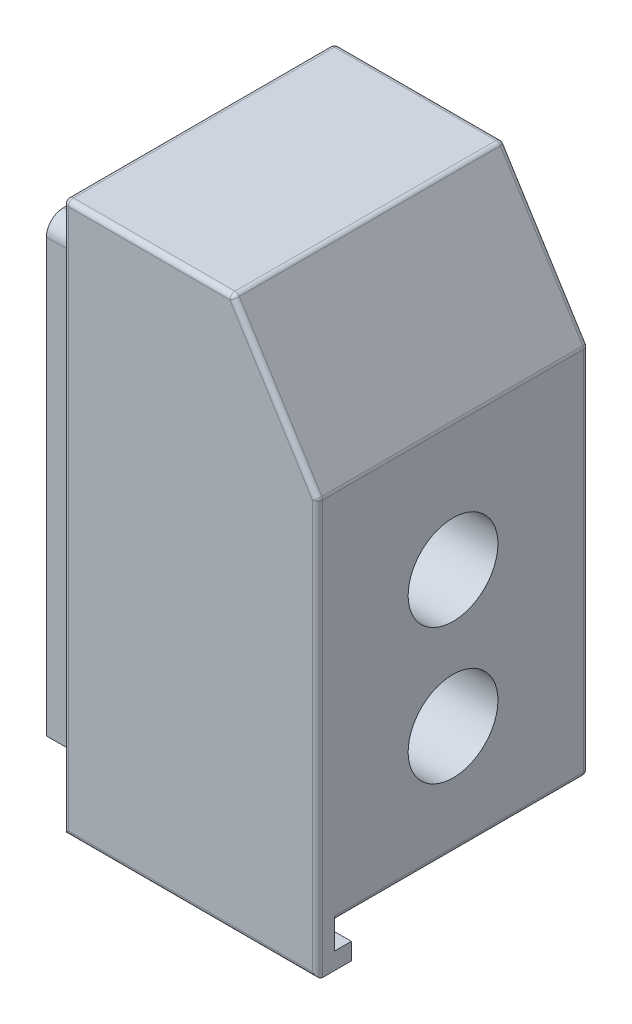
ISO-10303-21;
HEADER;
FILE_DESCRIPTION(('STEP AP214'),'2;1');
FILE_NAME('part.step','',(''),(''),'','','');
FILE_SCHEMA(('AUTOMOTIVE_DESIGN { 1 0 10303 214 1 1 1 1 }'));
ENDSEC;
DATA;
#1=APPLICATION_CONTEXT('core data for automotive mechanical design processes');
#2=APPLICATION_PROTOCOL_DEFINITION('international standard','automotive_design',2000,#1);
#3=PRODUCT_CONTEXT('',#1,'mechanical');
#4=PRODUCT('Part','Part','',(#3));
#5=PRODUCT_RELATED_PRODUCT_CATEGORY('part','',(#4));
#6=PRODUCT_DEFINITION_FORMATION('','',#4);
#7=PRODUCT_DEFINITION_CONTEXT('part definition',#1,'design');
#8=PRODUCT_DEFINITION('design','',#6,#7);
#9=PRODUCT_DEFINITION_SHAPE('','',#8);
#10=(LENGTH_UNIT() NAMED_UNIT(*) SI_UNIT(.MILLI.,.METRE.));
#11=(NAMED_UNIT(*) PLANE_ANGLE_UNIT() SI_UNIT($,.RADIAN.));
#12=(NAMED_UNIT(*) SI_UNIT($,.STERADIAN.) SOLID_ANGLE_UNIT());
#13=UNCERTAINTY_MEASURE_WITH_UNIT(LENGTH_MEASURE(1.E-05),#10,'distance_accuracy_value','');
#14=(GEOMETRIC_REPRESENTATION_CONTEXT(3) GLOBAL_UNCERTAINTY_ASSIGNED_CONTEXT((#13)) GLOBAL_UNIT_ASSIGNED_CONTEXT((#10,
#11,#12)) REPRESENTATION_CONTEXT('',''));
#15=CARTESIAN_POINT('',(0.,0.,0.));
#16=DIRECTION('',(0.,0.,1.));
#17=DIRECTION('',(1.,0.,0.));
#18=AXIS2_PLACEMENT_3D('',#15,#16,#17);
#19=CARTESIAN_POINT('',(-2.,27.5,1.));
#20=DIRECTION('',(0.,0.,1.));
#21=DIRECTION('',(0.,-1.,0.));
#22=AXIS2_PLACEMENT_3D('',#19,#20,#21);
#23=PLANE('',#22);
#24=DIRECTION('',(0.,-1.,0.));
#25=VECTOR('',#24,1.);
#26=CARTESIAN_POINT('',(-2.,27.5,1.));
#27=LINE('',#26,#25);
#28=CARTESIAN_POINT('',(-2.,26.5,1.));
#29=VERTEX_POINT('',#28);
#30=CARTESIAN_POINT('',(-2.,0.999999999999998,1.));
#31=VERTEX_POINT('',#30);
#32=EDGE_CURVE('E95',#29,#31,#27,.T.);
#33=ORIENTED_EDGE('',*,*,#32,.F.);
#34=DIRECTION('',(1.,0.,0.));
#35=VECTOR('',#34,1.);
#36=CARTESIAN_POINT('',(-2.,26.5,1.));
#37=LINE('',#36,#35);
#38=CARTESIAN_POINT('',(0.,26.5,1.));
#39=VERTEX_POINT('',#38);
#40=EDGE_CURVE('E12',#29,#39,#37,.T.);
#41=ORIENTED_EDGE('',*,*,#40,.T.);
#42=DIRECTION('',(0.,-1.,0.));
#43=VECTOR('',#42,1.);
#44=CARTESIAN_POINT('',(0.,27.5,1.));
#45=LINE('',#44,#43);
#46=CARTESIAN_POINT('',(0.,0.999999999999998,1.));
#47=VERTEX_POINT('',#46);
#48=EDGE_CURVE('E114',#39,#47,#45,.T.);
#49=ORIENTED_EDGE('',*,*,#48,.T.);
#50=DIRECTION('',(1.,0.,0.));
#51=VECTOR('',#50,1.);
#52=CARTESIAN_POINT('',(-2.,0.999999999999998,1.));
#53=LINE('',#52,#51);
#54=EDGE_CURVE('E108',#31,#47,#53,.T.);
#55=ORIENTED_EDGE('',*,*,#54,.F.);
#56=EDGE_LOOP('',(#33,#41,#49,#55));
#57=FACE_BOUND('',#56,.T.);
#58=ADVANCED_FACE('F42',(#57),#23,.F.);
#59=CARTESIAN_POINT('',(-2.,1.,15.));
#60=DIRECTION('',(0.,1.,0.));
#61=DIRECTION('',(0.,0.,1.));
#62=AXIS2_PLACEMENT_3D('',#59,#60,#61);
#63=PLANE('',#62);
#64=DIRECTION('',(0.,0.,1.));
#65=VECTOR('',#64,1.);
#66=CARTESIAN_POINT('',(0.,1.,15.));
#67=LINE('',#66,#65);
#68=CARTESIAN_POINT('',(0.,1.,15.));
#69=VERTEX_POINT('',#68);
#70=EDGE_CURVE('E147',#47,#69,#67,.T.);
#71=ORIENTED_EDGE('',*,*,#70,.T.);
#72=DIRECTION('',(1.,0.,0.));
#73=VECTOR('',#72,1.);
#74=CARTESIAN_POINT('',(-2.,1.,15.));
#75=LINE('',#74,#73);
#76=CARTESIAN_POINT('',(-2.,1.,15.));
#77=VERTEX_POINT('',#76);
#78=EDGE_CURVE('E110',#77,#69,#75,.T.);
#79=ORIENTED_EDGE('',*,*,#78,.F.);
#80=DIRECTION('',(0.,0.,1.));
#81=VECTOR('',#80,1.);
#82=CARTESIAN_POINT('',(-2.,1.,15.));
#83=LINE('',#82,#81);
#84=EDGE_CURVE('E98',#31,#77,#83,.T.);
#85=ORIENTED_EDGE('',*,*,#84,.F.);
#86=ORIENTED_EDGE('',*,*,#54,.T.);
#87=EDGE_LOOP('',(#71,#79,#85,#86));
#88=FACE_BOUND('',#87,.T.);
#89=ADVANCED_FACE('F107',(#88),#63,.F.);
#90=CARTESIAN_POINT('',(-2.,27.5,15.));
#91=DIRECTION('',(0.,0.,-1.));
#92=DIRECTION('',(0.,1.,0.));
#93=AXIS2_PLACEMENT_3D('',#90,#91,#92);
#94=PLANE('',#93);
#95=DIRECTION('',(0.,1.,0.));
#96=VECTOR('',#95,1.);
#97=CARTESIAN_POINT('',(0.,27.5,15.));
#98=LINE('',#97,#96);
#99=CARTESIAN_POINT('',(0.,26.5,15.));
#100=VERTEX_POINT('',#99);
#101=EDGE_CURVE('E145',#69,#100,#98,.T.);
#102=ORIENTED_EDGE('',*,*,#101,.T.);
#103=DIRECTION('',(1.,0.,0.));
#104=VECTOR('',#103,1.);
#105=CARTESIAN_POINT('',(-2.,26.5,15.));
#106=LINE('',#105,#104);
#107=CARTESIAN_POINT('',(-2.,26.5,15.));
#108=VERTEX_POINT('',#107);
#109=EDGE_CURVE('E65',#100,#108,#106,.F.);
#110=ORIENTED_EDGE('',*,*,#109,.T.);
#111=DIRECTION('',(0.,1.,0.));
#112=VECTOR('',#111,1.);
#113=CARTESIAN_POINT('',(-2.,27.5,15.));
#114=LINE('',#113,#112);
#115=EDGE_CURVE('E111',#77,#108,#114,.T.);
#116=ORIENTED_EDGE('',*,*,#115,.F.);
#117=ORIENTED_EDGE('',*,*,#78,.T.);
#118=EDGE_LOOP('',(#102,#110,#116,#117));
#119=FACE_BOUND('',#118,.T.);
#120=ADVANCED_FACE('F146',(#119),#94,.F.);
#121=CARTESIAN_POINT('',(-2.,27.5,15.));
#122=DIRECTION('',(0.,-1.,0.));
#123=DIRECTION('',(0.,0.,-1.));
#124=AXIS2_PLACEMENT_3D('',#121,#122,#123);
#125=PLANE('',#124);
#126=DIRECTION('',(0.,0.,-1.));
#127=VECTOR('',#126,1.);
#128=CARTESIAN_POINT('',(-2.,27.5,15.));
#129=LINE('',#128,#127);
#130=CARTESIAN_POINT('',(-2.,27.5,14.));
#131=VERTEX_POINT('',#130);
#132=CARTESIAN_POINT('',(-2.,27.5,2.00000000000001));
#133=VERTEX_POINT('',#132);
#134=EDGE_CURVE('E120',#131,#133,#129,.T.);
#135=ORIENTED_EDGE('',*,*,#134,.F.);
#136=DIRECTION('',(1.,0.,0.));
#137=VECTOR('',#136,1.);
#138=CARTESIAN_POINT('',(-2.,27.5,14.));
#139=LINE('',#138,#137);
#140=CARTESIAN_POINT('',(0.,27.5,14.));
#141=VERTEX_POINT('',#140);
#142=EDGE_CURVE('E118',#131,#141,#139,.T.);
#143=ORIENTED_EDGE('',*,*,#142,.T.);
#144=DIRECTION('',(0.,0.,-1.));
#145=VECTOR('',#144,1.);
#146=CARTESIAN_POINT('',(0.,27.5,15.));
#147=LINE('',#146,#145);
#148=CARTESIAN_POINT('',(0.,27.5,2.00000000000001));
#149=VERTEX_POINT('',#148);
#150=EDGE_CURVE('E103',#141,#149,#147,.T.);
#151=ORIENTED_EDGE('',*,*,#150,.T.);
#152=DIRECTION('',(1.,0.,0.));
#153=VECTOR('',#152,1.);
#154=CARTESIAN_POINT('',(-2.,27.5,2.));
#155=LINE('',#154,#153);
#156=EDGE_CURVE('E116',#149,#133,#155,.F.);
#157=ORIENTED_EDGE('',*,*,#156,.T.);
#158=EDGE_LOOP('',(#135,#143,#151,#157));
#159=FACE_BOUND('',#158,.T.);
#160=ADVANCED_FACE('F136',(#159),#125,.F.);
#161=CARTESIAN_POINT('',(-2.,0.,0.));
#162=DIRECTION('',(1.,0.,0.));
#163=DIRECTION('',(0.,0.,-1.));
#164=AXIS2_PLACEMENT_3D('',#161,#162,#163);
#165=PLANE('',#164);
#166=ORIENTED_EDGE('',*,*,#115,.T.);
#167=CARTESIAN_POINT('',(-2.,26.5,14.));
#168=DIRECTION('',(1.,0.,0.));
#169=DIRECTION('',(0.,0.,-1.));
#170=AXIS2_PLACEMENT_3D('',#167,#168,#169);
#171=CIRCLE('',#170,1.);
#172=EDGE_CURVE('E50',#108,#131,#171,.F.);
#173=ORIENTED_EDGE('',*,*,#172,.T.);
#174=ORIENTED_EDGE('',*,*,#134,.T.);
#175=CARTESIAN_POINT('',(-2.,26.5,2.));
#176=DIRECTION('',(1.,0.,0.));
#177=DIRECTION('',(0.,0.,-1.));
#178=AXIS2_PLACEMENT_3D('',#175,#176,#177);
#179=CIRCLE('',#178,1.);
#180=EDGE_CURVE('E57',#133,#29,#179,.F.);
#181=ORIENTED_EDGE('',*,*,#180,.T.);
#182=ORIENTED_EDGE('',*,*,#32,.T.);
#183=ORIENTED_EDGE('',*,*,#84,.T.);
#184=EDGE_LOOP('',(#166,#173,#174,#181,#182,#183));
#185=FACE_BOUND('',#184,.T.);
#186=ADVANCED_FACE('F97',(#185),#165,.F.);
#187=CARTESIAN_POINT('',(0.,0.,0.));
#188=DIRECTION('',(1.,0.,0.));
#189=DIRECTION('',(0.,0.,-1.));
#190=AXIS2_PLACEMENT_3D('',#187,#188,#189);
#191=PLANE('',#190);
#192=ORIENTED_EDGE('',*,*,#150,.F.);
#193=CARTESIAN_POINT('',(0.,26.5,14.));
#194=DIRECTION('',(1.,0.,0.));
#195=DIRECTION('',(0.,0.,-1.));
#196=AXIS2_PLACEMENT_3D('',#193,#194,#195);
#197=CIRCLE('',#196,1.);
#198=EDGE_CURVE('E128',#141,#100,#197,.T.);
#199=ORIENTED_EDGE('',*,*,#198,.T.);
#200=ORIENTED_EDGE('',*,*,#101,.F.);
#201=ORIENTED_EDGE('',*,*,#70,.F.);
#202=ORIENTED_EDGE('',*,*,#48,.F.);
#203=CARTESIAN_POINT('',(0.,26.5,2.));
#204=DIRECTION('',(1.,0.,0.));
#205=DIRECTION('',(0.,0.,-1.));
#206=AXIS2_PLACEMENT_3D('',#203,#204,#205);
#207=CIRCLE('',#206,1.);
#208=EDGE_CURVE('E126',#39,#149,#207,.T.);
#209=ORIENTED_EDGE('',*,*,#208,.T.);
#210=EDGE_LOOP('',(#192,#199,#200,#201,#202,#209));
#211=FACE_BOUND('',#210,.T.);
#212=ADVANCED_FACE('F144',(#211),#191,.T.);
#213=CARTESIAN_POINT('',(-2.,26.5,14.));
#214=DIRECTION('',(1.,0.,0.));
#215=DIRECTION('',(0.,0.,-1.));
#216=AXIS2_PLACEMENT_3D('',#213,#214,#215);
#217=CYLINDRICAL_SURFACE('',#216,1.);
#218=ORIENTED_EDGE('',*,*,#172,.F.);
#219=ORIENTED_EDGE('',*,*,#109,.F.);
#220=ORIENTED_EDGE('',*,*,#198,.F.);
#221=ORIENTED_EDGE('',*,*,#142,.F.);
#222=EDGE_LOOP('',(#218,#219,#220,#221));
#223=FACE_BOUND('',#222,.T.);
#224=ADVANCED_FACE('F141',(#223),#217,.T.);
#225=CARTESIAN_POINT('',(-2.,26.5,2.));
#226=DIRECTION('',(1.,0.,0.));
#227=DIRECTION('',(0.,0.,-1.));
#228=AXIS2_PLACEMENT_3D('',#225,#226,#227);
#229=CYLINDRICAL_SURFACE('',#228,1.);
#230=ORIENTED_EDGE('',*,*,#180,.F.);
#231=ORIENTED_EDGE('',*,*,#156,.F.);
#232=ORIENTED_EDGE('',*,*,#208,.F.);
#233=ORIENTED_EDGE('',*,*,#40,.F.);
#234=EDGE_LOOP('',(#230,#231,#232,#233));
#235=FACE_BOUND('',#234,.T.);
#236=ADVANCED_FACE('F44',(#235),#229,.T.);
#237=CLOSED_SHELL('',(#58,#89,#120,#160,#186,#212,#224,#236));
#238=MANIFOLD_SOLID_BREP('B2',#237);
#239=CARTESIAN_POINT('',(15.,0.,16.));
#240=DIRECTION('',(0.,1.,0.));
#241=DIRECTION('',(-1.,0.,0.));
#242=AXIS2_PLACEMENT_3D('',#239,#240,#241);
#243=PLANE('',#242);
#244=DIRECTION('',(0.,0.,-1.));
#245=VECTOR('',#244,1.);
#246=CARTESIAN_POINT('',(0.,0.,16.));
#247=LINE('',#246,#245);
#248=CARTESIAN_POINT('',(0.,0.,15.));
#249=VERTEX_POINT('',#248);
#250=CARTESIAN_POINT('',(0.,0.,0.300000000000002));
#251=VERTEX_POINT('',#250);
#252=EDGE_CURVE('E384',#249,#251,#247,.T.);
#253=ORIENTED_EDGE('',*,*,#252,.T.);
#254=DIRECTION('',(1.,0.,0.));
#255=VECTOR('',#254,1.);
#256=CARTESIAN_POINT('',(15.,0.,0.300000000000002));
#257=LINE('',#256,#255);
#258=CARTESIAN_POINT('',(14.7,0.,0.300000000000002));
#259=VERTEX_POINT('',#258);
#260=EDGE_CURVE('E428',#251,#259,#257,.T.);
#261=ORIENTED_EDGE('',*,*,#260,.T.);
#262=DIRECTION('',(0.,0.,-1.));
#263=VECTOR('',#262,1.);
#264=CARTESIAN_POINT('',(14.7,0.,16.));
#265=LINE('',#264,#263);
#266=CARTESIAN_POINT('',(14.7,0.,15.));
#267=VERTEX_POINT('',#266);
#268=EDGE_CURVE('E426',#259,#267,#265,.F.);
#269=ORIENTED_EDGE('',*,*,#268,.T.);
#270=DIRECTION('',(1.,0.,0.));
#271=VECTOR('',#270,1.);
#272=CARTESIAN_POINT('',(-3.20156211871642,0.,15.));
#273=LINE('',#272,#271);
#274=EDGE_CURVE('E380',#249,#267,#273,.T.);
#275=ORIENTED_EDGE('',*,*,#274,.F.);
#276=EDGE_LOOP('',(#253,#261,#269,#275));
#277=FACE_BOUND('',#276,.T.);
#278=ADVANCED_FACE('F217',(#277),#243,.F.);
#279=CARTESIAN_POINT('',(15.,22.,16.));
#280=DIRECTION('',(-1.,0.,0.));
#281=DIRECTION('',(0.,-1.,0.));
#282=AXIS2_PLACEMENT_3D('',#279,#280,#281);
#283=PLANE('',#282);
#284=CARTESIAN_POINT('',(15.,14.5,8.));
#285=DIRECTION('',(1.,0.,0.));
#286=DIRECTION('',(0.,1.,0.));
#287=AXIS2_PLACEMENT_3D('',#284,#285,#286);
#288=CIRCLE('',#287,2.65);
#289=CARTESIAN_POINT('',(15.,17.15,8.));
#290=VERTEX_POINT('',#289);
#291=EDGE_CURVE('E400',#290,#290,#288,.T.);
#292=ORIENTED_EDGE('',*,*,#291,.F.);
#293=EDGE_LOOP('',(#292));
#294=FACE_BOUND('',#293,.T.);
#295=CARTESIAN_POINT('',(15.,6.5,8.));
#296=DIRECTION('',(1.,0.,0.));
#297=DIRECTION('',(0.,1.,0.));
#298=AXIS2_PLACEMENT_3D('',#295,#296,#297);
#299=CIRCLE('',#298,2.65);
#300=CARTESIAN_POINT('',(15.,9.15,8.));
#301=VERTEX_POINT('',#300);
#302=EDGE_CURVE('E396',#301,#301,#299,.T.);
#303=ORIENTED_EDGE('',*,*,#302,.F.);
#304=EDGE_LOOP('',(#303));
#305=FACE_BOUND('',#304,.T.);
#306=DIRECTION('',(0.,0.,-1.));
#307=VECTOR('',#306,1.);
#308=CARTESIAN_POINT('',(15.,21.9139611320766,16.));
#309=LINE('',#308,#307);
#310=CARTESIAN_POINT('',(15.,21.9139611320766,0.300000000000002));
#311=VERTEX_POINT('',#310);
#312=CARTESIAN_POINT('',(15.,21.9139611320766,15.7));
#313=VERTEX_POINT('',#312);
#314=EDGE_CURVE('E406',#311,#313,#309,.F.);
#315=ORIENTED_EDGE('',*,*,#314,.T.);
#316=DIRECTION('',(0.,1.,0.));
#317=VECTOR('',#316,1.);
#318=CARTESIAN_POINT('',(15.,22.,15.7));
#319=LINE('',#318,#317);
#320=CARTESIAN_POINT('',(15.,-2.5,15.7));
#321=VERTEX_POINT('',#320);
#322=EDGE_CURVE('E351',#313,#321,#319,.F.);
#323=ORIENTED_EDGE('',*,*,#322,.T.);
#324=DIRECTION('',(0.,0.,-1.));
#325=VECTOR('',#324,1.);
#326=CARTESIAN_POINT('',(15.,-2.5,16.));
#327=LINE('',#326,#325);
#328=CARTESIAN_POINT('',(15.,-2.5,14.));
#329=VERTEX_POINT('',#328);
#330=EDGE_CURVE('E344',#321,#329,#327,.T.);
#331=ORIENTED_EDGE('',*,*,#330,.T.);
#332=DIRECTION('',(0.,1.,0.));
#333=VECTOR('',#332,1.);
#334=CARTESIAN_POINT('',(15.,-1.5,14.));
#335=LINE('',#334,#333);
#336=CARTESIAN_POINT('',(15.,-1.5,14.));
#337=VERTEX_POINT('',#336);
#338=EDGE_CURVE('E349',#329,#337,#335,.T.);
#339=ORIENTED_EDGE('',*,*,#338,.T.);
#340=DIRECTION('',(0.,0.,1.));
#341=VECTOR('',#340,1.);
#342=CARTESIAN_POINT('',(15.,-1.5,15.));
#343=LINE('',#342,#341);
#344=CARTESIAN_POINT('',(15.,-1.5,15.));
#345=VERTEX_POINT('',#344);
#346=EDGE_CURVE('E370',#337,#345,#343,.T.);
#347=ORIENTED_EDGE('',*,*,#346,.T.);
#348=DIRECTION('',(0.,1.,0.));
#349=VECTOR('',#348,1.);
#350=CARTESIAN_POINT('',(15.,0.,15.));
#351=LINE('',#350,#349);
#352=CARTESIAN_POINT('',(15.,0.299999999999998,15.));
#353=VERTEX_POINT('',#352);
#354=EDGE_CURVE('E365',#345,#353,#351,.T.);
#355=ORIENTED_EDGE('',*,*,#354,.T.);
#356=DIRECTION('',(0.,0.,-1.));
#357=VECTOR('',#356,1.);
#358=CARTESIAN_POINT('',(15.,0.299999999999998,16.));
#359=LINE('',#358,#357);
#360=CARTESIAN_POINT('',(15.,0.299999999999998,0.300000000000002));
#361=VERTEX_POINT('',#360);
#362=EDGE_CURVE('E401',#353,#361,#359,.T.);
#363=ORIENTED_EDGE('',*,*,#362,.T.);
#364=DIRECTION('',(0.,1.,0.));
#365=VECTOR('',#364,1.);
#366=CARTESIAN_POINT('',(15.,22.,0.300000000000002));
#367=LINE('',#366,#365);
#368=EDGE_CURVE('E403',#361,#311,#367,.T.);
#369=ORIENTED_EDGE('',*,*,#368,.T.);
#370=EDGE_LOOP('',(#315,#323,#331,#339,#347,#355,#363,#369));
#371=FACE_BOUND('',#370,.T.);
#372=ADVANCED_FACE('F346',(#294,#305,#371),#283,.F.);
#373=CARTESIAN_POINT('',(10.,30.,16.));
#374=DIRECTION('',(-0.847998304005088,-0.52999894000318,0.));
#375=DIRECTION('',(0.52999894000318,-0.847998304005088,0.));
#376=AXIS2_PLACEMENT_3D('',#373,#374,#375);
#377=PLANE('',#376);
#378=DIRECTION('',(-0.52999894000318,0.847998304005088,0.));
#379=VECTOR('',#378,1.);
#380=CARTESIAN_POINT('',(10.,30.,15.7));
#381=LINE('',#380,#379);
#382=CARTESIAN_POINT('',(10.0881251987494,29.8589996820009,15.7));
#383=VERTEX_POINT('',#382);
#384=CARTESIAN_POINT('',(14.9543994912015,22.0729608140776,15.7));
#385=VERTEX_POINT('',#384);
#386=EDGE_CURVE('E447',#383,#385,#381,.F.);
#387=ORIENTED_EDGE('',*,*,#386,.T.);
#388=DIRECTION('',(0.,0.,-1.));
#389=VECTOR('',#388,1.);
#390=CARTESIAN_POINT('',(14.9543994912015,22.0729608140776,16.));
#391=LINE('',#390,#389);
#392=CARTESIAN_POINT('',(14.9543994912015,22.0729608140776,0.300000000000002));
#393=VERTEX_POINT('',#392);
#394=EDGE_CURVE('E449',#385,#393,#391,.T.);
#395=ORIENTED_EDGE('',*,*,#394,.T.);
#396=DIRECTION('',(-0.52999894000318,0.847998304005088,0.));
#397=VECTOR('',#396,1.);
#398=CARTESIAN_POINT('',(10.,30.,0.300000000000002));
#399=LINE('',#398,#397);
#400=CARTESIAN_POINT('',(10.0881251987494,29.8589996820009,0.300000000000002));
#401=VERTEX_POINT('',#400);
#402=EDGE_CURVE('E445',#393,#401,#399,.T.);
#403=ORIENTED_EDGE('',*,*,#402,.T.);
#404=DIRECTION('',(0.,0.,-1.));
#405=VECTOR('',#404,1.);
#406=CARTESIAN_POINT('',(10.0881251987494,29.8589996820009,16.));
#407=LINE('',#406,#405);
#408=EDGE_CURVE('E443',#401,#383,#407,.F.);
#409=ORIENTED_EDGE('',*,*,#408,.T.);
#410=EDGE_LOOP('',(#387,#395,#403,#409));
#411=FACE_BOUND('',#410,.T.);
#412=ADVANCED_FACE('F606',(#411),#377,.F.);
#413=CARTESIAN_POINT('',(0.,30.,16.));
#414=DIRECTION('',(0.,-1.,0.));
#415=DIRECTION('',(0.,0.,-1.));
#416=AXIS2_PLACEMENT_3D('',#413,#414,#415);
#417=PLANE('',#416);
#418=DIRECTION('',(-1.,0.,0.));
#419=VECTOR('',#418,1.);
#420=CARTESIAN_POINT('',(0.,30.,15.7));
#421=LINE('',#420,#419);
#422=CARTESIAN_POINT('',(0.3,30.,15.7));
#423=VERTEX_POINT('',#422);
#424=CARTESIAN_POINT('',(9.83372570754788,30.,15.7));
#425=VERTEX_POINT('',#424);
#426=EDGE_CURVE('E234',#423,#425,#421,.F.);
#427=ORIENTED_EDGE('',*,*,#426,.T.);
#428=DIRECTION('',(0.,0.,-1.));
#429=VECTOR('',#428,1.);
#430=CARTESIAN_POINT('',(9.83372570754788,30.,16.));
#431=LINE('',#430,#429);
#432=CARTESIAN_POINT('',(9.83372570754788,30.,0.300000000000002));
#433=VERTEX_POINT('',#432);
#434=EDGE_CURVE('E226',#425,#433,#431,.T.);
#435=ORIENTED_EDGE('',*,*,#434,.T.);
#436=DIRECTION('',(-1.,0.,0.));
#437=VECTOR('',#436,1.);
#438=CARTESIAN_POINT('',(0.,30.,0.300000000000002));
#439=LINE('',#438,#437);
#440=CARTESIAN_POINT('',(0.3,30.,0.300000000000002));
#441=VERTEX_POINT('',#440);
#442=EDGE_CURVE('E452',#433,#441,#439,.T.);
#443=ORIENTED_EDGE('',*,*,#442,.T.);
#444=DIRECTION('',(0.,0.,-1.));
#445=VECTOR('',#444,1.);
#446=CARTESIAN_POINT('',(0.3,30.,16.));
#447=LINE('',#446,#445);
#448=EDGE_CURVE('E239',#441,#423,#447,.F.);
#449=ORIENTED_EDGE('',*,*,#448,.T.);
#450=EDGE_LOOP('',(#427,#435,#443,#449));
#451=FACE_BOUND('',#450,.T.);
#452=ADVANCED_FACE('F675',(#451),#417,.F.);
#453=CARTESIAN_POINT('',(0.,0.,16.));
#454=DIRECTION('',(1.,0.,0.));
#455=DIRECTION('',(0.,0.,-1.));
#456=AXIS2_PLACEMENT_3D('',#453,#454,#455);
#457=PLANE('',#456);
#458=CARTESIAN_POINT('',(0.,14.5,8.));
#459=DIRECTION('',(1.,0.,0.));
#460=DIRECTION('',(0.,0.,-1.));
#461=AXIS2_PLACEMENT_3D('',#458,#459,#460);
#462=CIRCLE('',#461,2.65);
#463=CARTESIAN_POINT('',(0.,14.5,5.35));
#464=VERTEX_POINT('',#463);
#465=EDGE_CURVE('E397',#464,#464,#462,.T.);
#466=ORIENTED_EDGE('',*,*,#465,.T.);
#467=EDGE_LOOP('',(#466));
#468=FACE_BOUND('',#467,.T.);
#469=CARTESIAN_POINT('',(0.,6.5,8.));
#470=DIRECTION('',(1.,0.,0.));
#471=DIRECTION('',(0.,0.,-1.));
#472=AXIS2_PLACEMENT_3D('',#469,#470,#471);
#473=CIRCLE('',#472,2.65);
#474=CARTESIAN_POINT('',(0.,6.5,5.35));
#475=VERTEX_POINT('',#474);
#476=EDGE_CURVE('E354',#475,#475,#473,.T.);
#477=ORIENTED_EDGE('',*,*,#476,.T.);
#478=EDGE_LOOP('',(#477));
#479=FACE_BOUND('',#478,.T.);
#480=DIRECTION('',(0.,0.,-1.));
#481=VECTOR('',#480,1.);
#482=CARTESIAN_POINT('',(0.,29.7,16.));
#483=LINE('',#482,#481);
#484=CARTESIAN_POINT('',(0.,29.7,15.7));
#485=VERTEX_POINT('',#484);
#486=CARTESIAN_POINT('',(0.,29.7,0.300000000000002));
#487=VERTEX_POINT('',#486);
#488=EDGE_CURVE('E420',#485,#487,#483,.T.);
#489=ORIENTED_EDGE('',*,*,#488,.T.);
#490=DIRECTION('',(0.,-1.,0.));
#491=VECTOR('',#490,1.);
#492=CARTESIAN_POINT('',(0.,0.,0.300000000000002));
#493=LINE('',#492,#491);
#494=EDGE_CURVE('E424',#487,#251,#493,.T.);
#495=ORIENTED_EDGE('',*,*,#494,.T.);
#496=ORIENTED_EDGE('',*,*,#252,.F.);
#497=DIRECTION('',(0.,-1.,0.));
#498=VECTOR('',#497,1.);
#499=CARTESIAN_POINT('',(0.,0.,15.));
#500=LINE('',#499,#498);
#501=CARTESIAN_POINT('',(0.,-1.5,15.));
#502=VERTEX_POINT('',#501);
#503=EDGE_CURVE('E389',#249,#502,#500,.T.);
#504=ORIENTED_EDGE('',*,*,#503,.T.);
#505=DIRECTION('',(0.,0.,-1.));
#506=VECTOR('',#505,1.);
#507=CARTESIAN_POINT('',(0.,-1.5,15.));
#508=LINE('',#507,#506);
#509=CARTESIAN_POINT('',(0.,-1.5,14.));
#510=VERTEX_POINT('',#509);
#511=EDGE_CURVE('E391',#502,#510,#508,.T.);
#512=ORIENTED_EDGE('',*,*,#511,.T.);
#513=DIRECTION('',(0.,-1.,0.));
#514=VECTOR('',#513,1.);
#515=CARTESIAN_POINT('',(0.,-1.5,14.));
#516=LINE('',#515,#514);
#517=CARTESIAN_POINT('',(0.,-2.5,14.));
#518=VERTEX_POINT('',#517);
#519=EDGE_CURVE('E535',#510,#518,#516,.T.);
#520=ORIENTED_EDGE('',*,*,#519,.T.);
#521=DIRECTION('',(0.,0.,1.));
#522=VECTOR('',#521,1.);
#523=CARTESIAN_POINT('',(0.,-2.5,16.));
#524=LINE('',#523,#522);
#525=CARTESIAN_POINT('',(0.,-2.5,15.7));
#526=VERTEX_POINT('',#525);
#527=EDGE_CURVE('E361',#518,#526,#524,.T.);
#528=ORIENTED_EDGE('',*,*,#527,.T.);
#529=DIRECTION('',(0.,-1.,0.));
#530=VECTOR('',#529,1.);
#531=CARTESIAN_POINT('',(0.,0.,15.7));
#532=LINE('',#531,#530);
#533=EDGE_CURVE('E422',#526,#485,#532,.F.);
#534=ORIENTED_EDGE('',*,*,#533,.T.);
#535=EDGE_LOOP('',(#489,#495,#496,#504,#512,#520,#528,#534));
#536=FACE_BOUND('',#535,.T.);
#537=ADVANCED_FACE('F538',(#468,#479,#536),#457,.F.);
#538=CARTESIAN_POINT('',(0.,0.,16.));
#539=DIRECTION('',(0.,0.,-1.));
#540=DIRECTION('',(-1.,0.,0.));
#541=AXIS2_PLACEMENT_3D('',#538,#539,#540);
#542=PLANE('',#541);
#543=DIRECTION('',(1.,0.,0.));
#544=VECTOR('',#543,1.);
#545=CARTESIAN_POINT('',(15.,-2.2,16.));
#546=LINE('',#545,#544);
#547=CARTESIAN_POINT('',(0.3,-2.2,16.));
#548=VERTEX_POINT('',#547);
#549=CARTESIAN_POINT('',(14.7,-2.2,16.));
#550=VERTEX_POINT('',#549);
#551=EDGE_CURVE('E436',#548,#550,#546,.T.);
#552=ORIENTED_EDGE('',*,*,#551,.T.);
#553=DIRECTION('',(0.,1.,0.));
#554=VECTOR('',#553,1.);
#555=CARTESIAN_POINT('',(14.7,0.,16.));
#556=LINE('',#555,#554);
#557=CARTESIAN_POINT('',(14.7,21.9139611320766,16.));
#558=VERTEX_POINT('',#557);
#559=EDGE_CURVE('E438',#550,#558,#556,.T.);
#560=ORIENTED_EDGE('',*,*,#559,.T.);
#561=DIRECTION('',(-0.52999894000318,0.847998304005088,0.));
#562=VECTOR('',#561,1.);
#563=CARTESIAN_POINT('',(20.4197578121693,12.7623486326058,16.));
#564=LINE('',#563,#562);
#565=CARTESIAN_POINT('',(9.83372570754788,29.7,16.));
#566=VERTEX_POINT('',#565);
#567=EDGE_CURVE('E432',#558,#566,#564,.T.);
#568=ORIENTED_EDGE('',*,*,#567,.T.);
#569=DIRECTION('',(-1.,0.,0.));
#570=VECTOR('',#569,1.);
#571=CARTESIAN_POINT('',(0.,29.7,16.));
#572=LINE('',#571,#570);
#573=CARTESIAN_POINT('',(0.3,29.7,16.));
#574=VERTEX_POINT('',#573);
#575=EDGE_CURVE('E430',#566,#574,#572,.T.);
#576=ORIENTED_EDGE('',*,*,#575,.T.);
#577=DIRECTION('',(0.,-1.,0.));
#578=VECTOR('',#577,1.);
#579=CARTESIAN_POINT('',(0.3,0.,16.));
#580=LINE('',#579,#578);
#581=EDGE_CURVE('E434',#574,#548,#580,.T.);
#582=ORIENTED_EDGE('',*,*,#581,.T.);
#583=EDGE_LOOP('',(#552,#560,#568,#576,#582));
#584=FACE_BOUND('',#583,.T.);
#585=ADVANCED_FACE('F583',(#584),#542,.F.);
#586=CARTESIAN_POINT('',(0.,0.,0.));
#587=DIRECTION('',(0.,0.,-1.));
#588=DIRECTION('',(-1.,0.,0.));
#589=AXIS2_PLACEMENT_3D('',#586,#587,#588);
#590=PLANE('',#589);
#591=DIRECTION('',(0.,1.,0.));
#592=VECTOR('',#591,1.);
#593=CARTESIAN_POINT('',(14.7,0.,0.));
#594=LINE('',#593,#592);
#595=CARTESIAN_POINT('',(14.7,21.9139611320766,0.));
#596=VERTEX_POINT('',#595);
#597=CARTESIAN_POINT('',(14.7,0.299999999999999,0.));
#598=VERTEX_POINT('',#597);
#599=EDGE_CURVE('E415',#596,#598,#594,.F.);
#600=ORIENTED_EDGE('',*,*,#599,.T.);
#601=DIRECTION('',(1.,0.,0.));
#602=VECTOR('',#601,1.);
#603=CARTESIAN_POINT('',(0.,0.3,0.));
#604=LINE('',#603,#602);
#605=CARTESIAN_POINT('',(0.3,0.3,0.));
#606=VERTEX_POINT('',#605);
#607=EDGE_CURVE('E418',#598,#606,#604,.F.);
#608=ORIENTED_EDGE('',*,*,#607,.T.);
#609=DIRECTION('',(0.,-1.,0.));
#610=VECTOR('',#609,1.);
#611=CARTESIAN_POINT('',(0.3,30.,0.));
#612=LINE('',#611,#610);
#613=CARTESIAN_POINT('',(0.3,29.7,0.));
#614=VERTEX_POINT('',#613);
#615=EDGE_CURVE('E413',#606,#614,#612,.F.);
#616=ORIENTED_EDGE('',*,*,#615,.T.);
#617=DIRECTION('',(-1.,0.,0.));
#618=VECTOR('',#617,1.);
#619=CARTESIAN_POINT('',(10.,29.7,0.));
#620=LINE('',#619,#618);
#621=CARTESIAN_POINT('',(9.83372570754788,29.7,0.));
#622=VERTEX_POINT('',#621);
#623=EDGE_CURVE('E409',#614,#622,#620,.F.);
#624=ORIENTED_EDGE('',*,*,#623,.T.);
#625=DIRECTION('',(-0.52999894000318,0.847998304005088,0.));
#626=VECTOR('',#625,1.);
#627=CARTESIAN_POINT('',(14.7456005087985,21.841000317999,0.));
#628=LINE('',#627,#626);
#629=EDGE_CURVE('E411',#622,#596,#628,.F.);
#630=ORIENTED_EDGE('',*,*,#629,.T.);
#631=EDGE_LOOP('',(#600,#608,#616,#624,#630));
#632=FACE_BOUND('',#631,.T.);
#633=ADVANCED_FACE('F688',(#632),#590,.T.);
#634=CARTESIAN_POINT('',(-3.20156211871642,0.,15.));
#635=DIRECTION('',(0.,0.,-1.));
#636=DIRECTION('',(-1.,0.,0.));
#637=AXIS2_PLACEMENT_3D('',#634,#635,#636);
#638=PLANE('',#637);
#639=ORIENTED_EDGE('',*,*,#503,.F.);
#640=ORIENTED_EDGE('',*,*,#274,.T.);
#641=CARTESIAN_POINT('',(14.7,0.299999999999998,15.));
#642=DIRECTION('',(0.,0.,-1.));
#643=DIRECTION('',(-1.,0.,0.));
#644=AXIS2_PLACEMENT_3D('',#641,#642,#643);
#645=CIRCLE('',#644,0.3);
#646=EDGE_CURVE('E40',#267,#353,#645,.F.);
#647=ORIENTED_EDGE('',*,*,#646,.T.);
#648=ORIENTED_EDGE('',*,*,#354,.F.);
#649=DIRECTION('',(1.,0.,0.));
#650=VECTOR('',#649,1.);
#651=CARTESIAN_POINT('',(-3.20156211871642,-1.5,15.));
#652=LINE('',#651,#650);
#653=EDGE_CURVE('E377',#502,#345,#652,.T.);
#654=ORIENTED_EDGE('',*,*,#653,.F.);
#655=EDGE_LOOP('',(#639,#640,#647,#648,#654));
#656=FACE_BOUND('',#655,.T.);
#657=ADVANCED_FACE('F547',(#656),#638,.T.);
#658=CARTESIAN_POINT('',(-3.20156211871642,-1.5,15.));
#659=DIRECTION('',(0.,1.,0.));
#660=DIRECTION('',(-1.,0.,0.));
#661=AXIS2_PLACEMENT_3D('',#658,#659,#660);
#662=PLANE('',#661);
#663=ORIENTED_EDGE('',*,*,#511,.F.);
#664=ORIENTED_EDGE('',*,*,#653,.T.);
#665=ORIENTED_EDGE('',*,*,#346,.F.);
#666=DIRECTION('',(1.,0.,0.));
#667=VECTOR('',#666,1.);
#668=CARTESIAN_POINT('',(-3.20156211871642,-1.5,14.));
#669=LINE('',#668,#667);
#670=EDGE_CURVE('E364',#510,#337,#669,.T.);
#671=ORIENTED_EDGE('',*,*,#670,.F.);
#672=EDGE_LOOP('',(#663,#664,#665,#671));
#673=FACE_BOUND('',#672,.T.);
#674=ADVANCED_FACE('F543',(#673),#662,.T.);
#675=CARTESIAN_POINT('',(-3.20156211871642,-1.5,14.));
#676=DIRECTION('',(0.,0.,-1.));
#677=DIRECTION('',(-1.,0.,0.));
#678=AXIS2_PLACEMENT_3D('',#675,#676,#677);
#679=PLANE('',#678);
#680=ORIENTED_EDGE('',*,*,#519,.F.);
#681=ORIENTED_EDGE('',*,*,#670,.T.);
#682=ORIENTED_EDGE('',*,*,#338,.F.);
#683=DIRECTION('',(1.,0.,0.));
#684=VECTOR('',#683,1.);
#685=CARTESIAN_POINT('',(-3.20156211871642,-2.5,14.));
#686=LINE('',#685,#684);
#687=EDGE_CURVE('E358',#518,#329,#686,.T.);
#688=ORIENTED_EDGE('',*,*,#687,.F.);
#689=EDGE_LOOP('',(#680,#681,#682,#688));
#690=FACE_BOUND('',#689,.T.);
#691=ADVANCED_FACE('F367',(#690),#679,.T.);
#692=CARTESIAN_POINT('',(-3.20156211871642,-2.5,16.));
#693=DIRECTION('',(0.,-1.,0.));
#694=DIRECTION('',(1.,0.,0.));
#695=AXIS2_PLACEMENT_3D('',#692,#693,#694);
#696=PLANE('',#695);
#697=ORIENTED_EDGE('',*,*,#330,.F.);
#698=DIRECTION('',(1.,0.,0.));
#699=VECTOR('',#698,1.);
#700=CARTESIAN_POINT('',(0.,-2.5,15.7));
#701=LINE('',#700,#699);
#702=EDGE_CURVE('E441',#321,#526,#701,.F.);
#703=ORIENTED_EDGE('',*,*,#702,.T.);
#704=ORIENTED_EDGE('',*,*,#527,.F.);
#705=ORIENTED_EDGE('',*,*,#687,.T.);
#706=EDGE_LOOP('',(#697,#703,#704,#705));
#707=FACE_BOUND('',#706,.T.);
#708=ADVANCED_FACE('F359',(#707),#696,.T.);
#709=CARTESIAN_POINT('',(-5.00000000014378E-05,6.5,8.));
#710=DIRECTION('',(1.,0.,0.));
#711=DIRECTION('',(0.,1.,0.));
#712=AXIS2_PLACEMENT_3D('',#709,#710,#711);
#713=CYLINDRICAL_SURFACE('',#712,2.65);
#714=ORIENTED_EDGE('',*,*,#302,.T.);
#715=EDGE_LOOP('',(#714));
#716=FACE_BOUND('',#715,.T.);
#717=ORIENTED_EDGE('',*,*,#476,.F.);
#718=EDGE_LOOP('',(#717));
#719=FACE_BOUND('',#718,.T.);
#720=ADVANCED_FACE('F706',(#716,#719),#713,.F.);
#721=CARTESIAN_POINT('',(-5.00000000014378E-05,14.5,8.));
#722=DIRECTION('',(1.,0.,0.));
#723=DIRECTION('',(0.,1.,0.));
#724=AXIS2_PLACEMENT_3D('',#721,#722,#723);
#725=CYLINDRICAL_SURFACE('',#724,2.65);
#726=ORIENTED_EDGE('',*,*,#291,.T.);
#727=EDGE_LOOP('',(#726));
#728=FACE_BOUND('',#727,.T.);
#729=ORIENTED_EDGE('',*,*,#465,.F.);
#730=EDGE_LOOP('',(#729));
#731=FACE_BOUND('',#730,.T.);
#732=ADVANCED_FACE('F598',(#728,#731),#725,.F.);
#733=CARTESIAN_POINT('',(0.3,29.7,15.7));
#734=DIRECTION('',(0.,0.,1.));
#735=DIRECTION('',(1.,0.,0.));
#736=AXIS2_PLACEMENT_3D('',#733,#734,#735);
#737=SPHERICAL_SURFACE('',#736,0.3);
#738=CARTESIAN_POINT('',(0.3,29.7,15.7));
#739=DIRECTION('',(0.,0.,1.));
#740=DIRECTION('',(1.,0.,0.));
#741=AXIS2_PLACEMENT_3D('',#738,#739,#740);
#742=CIRCLE('',#741,0.3);
#743=EDGE_CURVE('E515',#485,#423,#742,.F.);
#744=ORIENTED_EDGE('',*,*,#743,.F.);
#745=CARTESIAN_POINT('',(0.3,29.7,15.7));
#746=DIRECTION('',(0.,1.,0.));
#747=DIRECTION('',(0.,0.,1.));
#748=AXIS2_PLACEMENT_3D('',#745,#746,#747);
#749=CIRCLE('',#748,0.3);
#750=EDGE_CURVE('E221',#574,#485,#749,.F.);
#751=ORIENTED_EDGE('',*,*,#750,.F.);
#752=CARTESIAN_POINT('',(0.3,29.7,15.7));
#753=DIRECTION('',(-1.,0.,0.));
#754=DIRECTION('',(0.,0.,1.));
#755=AXIS2_PLACEMENT_3D('',#752,#753,#754);
#756=CIRCLE('',#755,0.3);
#757=EDGE_CURVE('E516',#423,#574,#756,.F.);
#758=ORIENTED_EDGE('',*,*,#757,.F.);
#759=EDGE_LOOP('',(#744,#751,#758));
#760=FACE_BOUND('',#759,.T.);
#761=ADVANCED_FACE('F219',(#760),#737,.T.);
#762=CARTESIAN_POINT('',(0.3,0.,15.7));
#763=DIRECTION('',(0.,-1.,0.));
#764=DIRECTION('',(0.,0.,-1.));
#765=AXIS2_PLACEMENT_3D('',#762,#763,#764);
#766=CYLINDRICAL_SURFACE('',#765,0.3);
#767=ORIENTED_EDGE('',*,*,#750,.T.);
#768=ORIENTED_EDGE('',*,*,#533,.F.);
#769=CARTESIAN_POINT('',(0.3,-2.2,15.7));
#770=DIRECTION('',(0.707106781186548,-0.707106781186547,0.));
#771=DIRECTION('',(-0.707106781186547,-0.707106781186548,0.));
#772=AXIS2_PLACEMENT_3D('',#769,#770,#771);
#773=ELLIPSE('',#772,0.424264068711929,0.3);
#774=EDGE_CURVE('E512',#548,#526,#773,.T.);
#775=ORIENTED_EDGE('',*,*,#774,.F.);
#776=ORIENTED_EDGE('',*,*,#581,.F.);
#777=EDGE_LOOP('',(#767,#768,#775,#776));
#778=FACE_BOUND('',#777,.T.);
#779=ADVANCED_FACE('F589',(#778),#766,.T.);
#780=CARTESIAN_POINT('',(0.,29.7,15.7));
#781=DIRECTION('',(-1.,0.,0.));
#782=DIRECTION('',(0.,0.,1.));
#783=AXIS2_PLACEMENT_3D('',#780,#781,#782);
#784=CYLINDRICAL_SURFACE('',#783,0.3);
#785=ORIENTED_EDGE('',*,*,#757,.T.);
#786=ORIENTED_EDGE('',*,*,#575,.F.);
#787=CARTESIAN_POINT('',(9.83372570754788,29.7,15.7));
#788=DIRECTION('',(1.,0.,0.));
#789=DIRECTION('',(0.,0.,-1.));
#790=AXIS2_PLACEMENT_3D('',#787,#788,#789);
#791=CIRCLE('',#790,0.3);
#792=EDGE_CURVE('E509',#425,#566,#791,.T.);
#793=ORIENTED_EDGE('',*,*,#792,.F.);
#794=ORIENTED_EDGE('',*,*,#426,.F.);
#795=EDGE_LOOP('',(#785,#786,#793,#794));
#796=FACE_BOUND('',#795,.T.);
#797=ADVANCED_FACE('F591',(#796),#784,.T.);
#798=CARTESIAN_POINT('',(0.3,29.7,16.));
#799=DIRECTION('',(0.,0.,-1.));
#800=DIRECTION('',(-1.,0.,0.));
#801=AXIS2_PLACEMENT_3D('',#798,#799,#800);
#802=CYLINDRICAL_SURFACE('',#801,0.3);
#803=ORIENTED_EDGE('',*,*,#743,.T.);
#804=ORIENTED_EDGE('',*,*,#448,.F.);
#805=CARTESIAN_POINT('',(0.3,29.7,0.300000000000002));
#806=DIRECTION('',(0.,0.,-1.));
#807=DIRECTION('',(-1.,0.,0.));
#808=AXIS2_PLACEMENT_3D('',#805,#806,#807);
#809=CIRCLE('',#808,0.3);
#810=EDGE_CURVE('E506',#487,#441,#809,.T.);
#811=ORIENTED_EDGE('',*,*,#810,.F.);
#812=ORIENTED_EDGE('',*,*,#488,.F.);
#813=EDGE_LOOP('',(#803,#804,#811,#812));
#814=FACE_BOUND('',#813,.T.);
#815=ADVANCED_FACE('F596',(#814),#802,.T.);
#816=CARTESIAN_POINT('',(0.,-2.2,15.7));
#817=DIRECTION('',(-1.,0.,0.));
#818=DIRECTION('',(0.,-1.,0.));
#819=AXIS2_PLACEMENT_3D('',#816,#817,#818);
#820=CYLINDRICAL_SURFACE('',#819,0.3);
#821=ORIENTED_EDGE('',*,*,#774,.T.);
#822=ORIENTED_EDGE('',*,*,#702,.F.);
#823=CARTESIAN_POINT('',(14.7,-2.2,15.7));
#824=DIRECTION('',(-0.707106781186547,-0.707106781186548,0.));
#825=DIRECTION('',(-0.707106781186548,0.707106781186547,0.));
#826=AXIS2_PLACEMENT_3D('',#823,#824,#825);
#827=ELLIPSE('',#826,0.424264068711928,0.3);
#828=EDGE_CURVE('E503',#550,#321,#827,.F.);
#829=ORIENTED_EDGE('',*,*,#828,.F.);
#830=ORIENTED_EDGE('',*,*,#551,.F.);
#831=EDGE_LOOP('',(#821,#822,#829,#830));
#832=FACE_BOUND('',#831,.T.);
#833=ADVANCED_FACE('F588',(#832),#820,.T.);
#834=CARTESIAN_POINT('',(9.83372570754788,29.7,15.7));
#835=DIRECTION('',(0.,0.,1.));
#836=DIRECTION('',(1.,0.,0.));
#837=AXIS2_PLACEMENT_3D('',#834,#835,#836);
#838=SPHERICAL_SURFACE('',#837,0.3);
#839=CARTESIAN_POINT('',(9.83372570754788,29.7,15.7));
#840=DIRECTION('',(0.,0.,1.));
#841=DIRECTION('',(1.,0.,0.));
#842=AXIS2_PLACEMENT_3D('',#839,#840,#841);
#843=CIRCLE('',#842,0.3);
#844=EDGE_CURVE('E497',#425,#383,#843,.F.);
#845=ORIENTED_EDGE('',*,*,#844,.F.);
#846=ORIENTED_EDGE('',*,*,#792,.T.);
#847=CARTESIAN_POINT('',(9.83372570754788,29.7,15.7));
#848=DIRECTION('',(-0.529998940003184,0.847998304005086,0.));
#849=DIRECTION('',(-0.847998304005086,-0.529998940003184,0.));
#850=AXIS2_PLACEMENT_3D('',#847,#848,#849);
#851=CIRCLE('',#850,0.3);
#852=EDGE_CURVE('E500',#383,#566,#851,.F.);
#853=ORIENTED_EDGE('',*,*,#852,.F.);
#854=EDGE_LOOP('',(#845,#846,#853));
#855=FACE_BOUND('',#854,.T.);
#856=ADVANCED_FACE('F657',(#855),#838,.T.);
#857=CARTESIAN_POINT('',(0.3,29.7,0.3));
#858=DIRECTION('',(0.,0.,1.));
#859=DIRECTION('',(1.,0.,0.));
#860=AXIS2_PLACEMENT_3D('',#857,#858,#859);
#861=SPHERICAL_SURFACE('',#860,0.3);
#862=CARTESIAN_POINT('',(0.3,29.7,0.3));
#863=DIRECTION('',(0.,1.,0.));
#864=DIRECTION('',(0.,0.,1.));
#865=AXIS2_PLACEMENT_3D('',#862,#863,#864);
#866=CIRCLE('',#865,0.3);
#867=EDGE_CURVE('E491',#487,#614,#866,.F.);
#868=ORIENTED_EDGE('',*,*,#867,.F.);
#869=ORIENTED_EDGE('',*,*,#810,.T.);
#870=CARTESIAN_POINT('',(0.3,29.7,0.300000000000002));
#871=DIRECTION('',(-1.,0.,0.));
#872=DIRECTION('',(0.,0.,1.));
#873=AXIS2_PLACEMENT_3D('',#870,#871,#872);
#874=CIRCLE('',#873,0.3);
#875=EDGE_CURVE('E494',#614,#441,#874,.F.);
#876=ORIENTED_EDGE('',*,*,#875,.F.);
#877=EDGE_LOOP('',(#868,#869,#876));
#878=FACE_BOUND('',#877,.T.);
#879=ADVANCED_FACE('F654',(#878),#861,.T.);
#880=CARTESIAN_POINT('',(14.7,0.,15.7));
#881=DIRECTION('',(0.,1.,0.));
#882=DIRECTION('',(-1.,0.,0.));
#883=AXIS2_PLACEMENT_3D('',#880,#881,#882);
#884=CYLINDRICAL_SURFACE('',#883,0.3);
#885=ORIENTED_EDGE('',*,*,#828,.T.);
#886=ORIENTED_EDGE('',*,*,#322,.F.);
#887=CARTESIAN_POINT('',(14.7,21.9139611320766,15.7));
#888=DIRECTION('',(0.,1.,0.));
#889=DIRECTION('',(-1.,0.,0.));
#890=AXIS2_PLACEMENT_3D('',#887,#888,#889);
#891=CIRCLE('',#890,0.3);
#892=EDGE_CURVE('E488',#558,#313,#891,.T.);
#893=ORIENTED_EDGE('',*,*,#892,.F.);
#894=ORIENTED_EDGE('',*,*,#559,.F.);
#895=EDGE_LOOP('',(#885,#886,#893,#894));
#896=FACE_BOUND('',#895,.T.);
#897=ADVANCED_FACE('F577',(#896),#884,.T.);
#898=CARTESIAN_POINT('',(20.4197578121693,12.7623486326058,15.7));
#899=DIRECTION('',(-0.52999894000318,0.847998304005088,0.));
#900=DIRECTION('',(-0.847998304005088,-0.52999894000318,0.));
#901=AXIS2_PLACEMENT_3D('',#898,#899,#900);
#902=CYLINDRICAL_SURFACE('',#901,0.3);
#903=ORIENTED_EDGE('',*,*,#852,.T.);
#904=ORIENTED_EDGE('',*,*,#567,.F.);
#905=CARTESIAN_POINT('',(14.7,21.9139611320766,15.7));
#906=DIRECTION('',(0.529998940003176,-0.847998304005091,0.));
#907=DIRECTION('',(0.847998304005091,0.529998940003176,0.));
#908=AXIS2_PLACEMENT_3D('',#905,#906,#907);
#909=CIRCLE('',#908,0.3);
#910=EDGE_CURVE('E486',#385,#558,#909,.T.);
#911=ORIENTED_EDGE('',*,*,#910,.F.);
#912=ORIENTED_EDGE('',*,*,#386,.F.);
#913=EDGE_LOOP('',(#903,#904,#911,#912));
#914=FACE_BOUND('',#913,.T.);
#915=ADVANCED_FACE('F579',(#914),#902,.T.);
#916=CARTESIAN_POINT('',(9.83372570754788,29.7,16.));
#917=DIRECTION('',(0.,0.,-1.));
#918=DIRECTION('',(-1.,0.,0.));
#919=AXIS2_PLACEMENT_3D('',#916,#917,#918);
#920=CYLINDRICAL_SURFACE('',#919,0.3);
#921=ORIENTED_EDGE('',*,*,#844,.T.);
#922=ORIENTED_EDGE('',*,*,#408,.F.);
#923=CARTESIAN_POINT('',(9.83372570754788,29.7,0.300000000000002));
#924=DIRECTION('',(0.,0.,-1.));
#925=DIRECTION('',(-1.,0.,0.));
#926=AXIS2_PLACEMENT_3D('',#923,#924,#925);
#927=CIRCLE('',#926,0.3);
#928=EDGE_CURVE('E483',#433,#401,#927,.T.);
#929=ORIENTED_EDGE('',*,*,#928,.F.);
#930=ORIENTED_EDGE('',*,*,#434,.F.);
#931=EDGE_LOOP('',(#921,#922,#929,#930));
#932=FACE_BOUND('',#931,.T.);
#933=ADVANCED_FACE('F645',(#932),#920,.T.);
#934=CARTESIAN_POINT('',(0.,29.7,0.300000000000002));
#935=DIRECTION('',(1.,0.,0.));
#936=DIRECTION('',(0.,0.,-1.));
#937=AXIS2_PLACEMENT_3D('',#934,#935,#936);
#938=CYLINDRICAL_SURFACE('',#937,0.3);
#939=ORIENTED_EDGE('',*,*,#875,.T.);
#940=ORIENTED_EDGE('',*,*,#442,.F.);
#941=CARTESIAN_POINT('',(9.83372570754788,29.7,0.3));
#942=DIRECTION('',(1.,0.,0.));
#943=DIRECTION('',(0.,1.,0.));
#944=AXIS2_PLACEMENT_3D('',#941,#942,#943);
#945=CIRCLE('',#944,0.3);
#946=EDGE_CURVE('E481',#622,#433,#945,.T.);
#947=ORIENTED_EDGE('',*,*,#946,.F.);
#948=ORIENTED_EDGE('',*,*,#623,.F.);
#949=EDGE_LOOP('',(#939,#940,#947,#948));
#950=FACE_BOUND('',#949,.T.);
#951=ADVANCED_FACE('F641',(#950),#938,.T.);
#952=CARTESIAN_POINT('',(0.3,0.,0.300000000000002));
#953=DIRECTION('',(0.,1.,0.));
#954=DIRECTION('',(0.,0.,1.));
#955=AXIS2_PLACEMENT_3D('',#952,#953,#954);
#956=CYLINDRICAL_SURFACE('',#955,0.3);
#957=ORIENTED_EDGE('',*,*,#867,.T.);
#958=ORIENTED_EDGE('',*,*,#615,.F.);
#959=CARTESIAN_POINT('',(0.3,0.3,0.300000000000002));
#960=DIRECTION('',(-0.707106781186547,0.707106781186547,0.));
#961=DIRECTION('',(-0.707106781186548,-0.707106781186547,0.));
#962=AXIS2_PLACEMENT_3D('',#959,#960,#961);
#963=ELLIPSE('',#962,0.424264068711928,0.3);
#964=EDGE_CURVE('E478',#251,#606,#963,.F.);
#965=ORIENTED_EDGE('',*,*,#964,.F.);
#966=ORIENTED_EDGE('',*,*,#494,.F.);
#967=EDGE_LOOP('',(#957,#958,#965,#966));
#968=FACE_BOUND('',#967,.T.);
#969=ADVANCED_FACE('F638',(#968),#956,.T.);
#970=CARTESIAN_POINT('',(14.7,21.9139611320766,15.7));
#971=DIRECTION('',(0.,0.,1.));
#972=DIRECTION('',(1.,0.,0.));
#973=AXIS2_PLACEMENT_3D('',#970,#971,#972);
#974=SPHERICAL_SURFACE('',#973,0.3);
#975=ORIENTED_EDGE('',*,*,#910,.T.);
#976=ORIENTED_EDGE('',*,*,#892,.T.);
#977=CARTESIAN_POINT('',(14.7,21.9139611320766,15.7));
#978=DIRECTION('',(0.,0.,1.));
#979=DIRECTION('',(1.,0.,0.));
#980=AXIS2_PLACEMENT_3D('',#977,#978,#979);
#981=CIRCLE('',#980,0.3);
#982=EDGE_CURVE('E475',#385,#313,#981,.F.);
#983=ORIENTED_EDGE('',*,*,#982,.F.);
#984=EDGE_LOOP('',(#975,#976,#983));
#985=FACE_BOUND('',#984,.T.);
#986=ADVANCED_FACE('F571',(#985),#974,.T.);
#987=CARTESIAN_POINT('',(9.83372570754788,29.7,0.3));
#988=DIRECTION('',(0.,0.,1.));
#989=DIRECTION('',(1.,0.,0.));
#990=AXIS2_PLACEMENT_3D('',#987,#988,#989);
#991=SPHERICAL_SURFACE('',#990,0.3);
#992=ORIENTED_EDGE('',*,*,#946,.T.);
#993=ORIENTED_EDGE('',*,*,#928,.T.);
#994=CARTESIAN_POINT('',(9.83372570754788,29.7,0.300000000000002));
#995=DIRECTION('',(-0.529998940003176,0.847998304005091,0.));
#996=DIRECTION('',(-0.847998304005091,-0.529998940003176,0.));
#997=AXIS2_PLACEMENT_3D('',#994,#995,#996);
#998=CIRCLE('',#997,0.3);
#999=EDGE_CURVE('E472',#622,#401,#998,.F.);
#1000=ORIENTED_EDGE('',*,*,#999,.F.);
#1001=EDGE_LOOP('',(#992,#993,#1000));
#1002=FACE_BOUND('',#1001,.T.);
#1003=ADVANCED_FACE('F631',(#1002),#991,.T.);
#1004=CARTESIAN_POINT('',(15.,0.299999999999999,0.300000000000002));
#1005=DIRECTION('',(-1.,0.,0.));
#1006=DIRECTION('',(0.,-1.,0.));
#1007=AXIS2_PLACEMENT_3D('',#1004,#1005,#1006);
#1008=CYLINDRICAL_SURFACE('',#1007,0.3);
#1009=ORIENTED_EDGE('',*,*,#964,.T.);
#1010=ORIENTED_EDGE('',*,*,#607,.F.);
#1011=CARTESIAN_POINT('',(14.7,0.299999999999999,0.300000000000002));
#1012=DIRECTION('',(1.,0.,0.));
#1013=DIRECTION('',(0.,0.,-1.));
#1014=AXIS2_PLACEMENT_3D('',#1011,#1012,#1013);
#1015=CIRCLE('',#1014,0.3);
#1016=EDGE_CURVE('E469',#259,#598,#1015,.T.);
#1017=ORIENTED_EDGE('',*,*,#1016,.F.);
#1018=ORIENTED_EDGE('',*,*,#260,.F.);
#1019=EDGE_LOOP('',(#1009,#1010,#1017,#1018));
#1020=FACE_BOUND('',#1019,.T.);
#1021=ADVANCED_FACE('F628',(#1020),#1008,.T.);
#1022=CARTESIAN_POINT('',(14.7,0.299999999999998,16.));
#1023=DIRECTION('',(0.,0.,-1.));
#1024=DIRECTION('',(-1.,0.,0.));
#1025=AXIS2_PLACEMENT_3D('',#1022,#1023,#1024);
#1026=CYLINDRICAL_SURFACE('',#1025,0.3);
#1027=ORIENTED_EDGE('',*,*,#646,.F.);
#1028=ORIENTED_EDGE('',*,*,#268,.F.);
#1029=CARTESIAN_POINT('',(14.7,0.299999999999998,0.300000000000002));
#1030=DIRECTION('',(0.,0.,-1.));
#1031=DIRECTION('',(-1.,0.,0.));
#1032=AXIS2_PLACEMENT_3D('',#1029,#1030,#1031);
#1033=CIRCLE('',#1032,0.3);
#1034=EDGE_CURVE('E466',#361,#259,#1033,.T.);
#1035=ORIENTED_EDGE('',*,*,#1034,.F.);
#1036=ORIENTED_EDGE('',*,*,#362,.F.);
#1037=EDGE_LOOP('',(#1027,#1028,#1035,#1036));
#1038=FACE_BOUND('',#1037,.T.);
#1039=ADVANCED_FACE('F553',(#1038),#1026,.T.);
#1040=CARTESIAN_POINT('',(14.7,21.9139611320766,16.));
#1041=DIRECTION('',(0.,0.,-1.));
#1042=DIRECTION('',(-1.,0.,0.));
#1043=AXIS2_PLACEMENT_3D('',#1040,#1041,#1042);
#1044=CYLINDRICAL_SURFACE('',#1043,0.3);
#1045=ORIENTED_EDGE('',*,*,#982,.T.);
#1046=ORIENTED_EDGE('',*,*,#314,.F.);
#1047=CARTESIAN_POINT('',(14.7,21.9139611320766,0.300000000000002));
#1048=DIRECTION('',(0.,0.,-1.));
#1049=DIRECTION('',(-1.,0.,0.));
#1050=AXIS2_PLACEMENT_3D('',#1047,#1048,#1049);
#1051=CIRCLE('',#1050,0.3);
#1052=EDGE_CURVE('E463',#393,#311,#1051,.T.);
#1053=ORIENTED_EDGE('',*,*,#1052,.F.);
#1054=ORIENTED_EDGE('',*,*,#394,.F.);
#1055=EDGE_LOOP('',(#1045,#1046,#1053,#1054));
#1056=FACE_BOUND('',#1055,.T.);
#1057=ADVANCED_FACE('F568',(#1056),#1044,.T.);
#1058=CARTESIAN_POINT('',(9.74560050879847,29.841000317999,0.300000000000002));
#1059=DIRECTION('',(0.52999894000318,-0.847998304005088,0.));
#1060=DIRECTION('',(0.847998304005088,0.52999894000318,0.));
#1061=AXIS2_PLACEMENT_3D('',#1058,#1059,#1060);
#1062=CYLINDRICAL_SURFACE('',#1061,0.3);
#1063=ORIENTED_EDGE('',*,*,#999,.T.);
#1064=ORIENTED_EDGE('',*,*,#402,.F.);
#1065=CARTESIAN_POINT('',(14.7,21.9139611320766,0.3));
#1066=DIRECTION('',(0.529998940003176,-0.847998304005091,0.));
#1067=DIRECTION('',(0.847998304005091,0.529998940003176,0.));
#1068=AXIS2_PLACEMENT_3D('',#1065,#1066,#1067);
#1069=CIRCLE('',#1068,0.3);
#1070=EDGE_CURVE('E461',#596,#393,#1069,.T.);
#1071=ORIENTED_EDGE('',*,*,#1070,.F.);
#1072=ORIENTED_EDGE('',*,*,#629,.F.);
#1073=EDGE_LOOP('',(#1063,#1064,#1071,#1072));
#1074=FACE_BOUND('',#1073,.T.);
#1075=ADVANCED_FACE('F619',(#1074),#1062,.T.);
#1076=CARTESIAN_POINT('',(14.7,0.299999999999999,0.3));
#1077=DIRECTION('',(0.,0.,1.));
#1078=DIRECTION('',(1.,0.,0.));
#1079=AXIS2_PLACEMENT_3D('',#1076,#1077,#1078);
#1080=SPHERICAL_SURFACE('',#1079,0.3);
#1081=ORIENTED_EDGE('',*,*,#1034,.T.);
#1082=ORIENTED_EDGE('',*,*,#1016,.T.);
#1083=CARTESIAN_POINT('',(14.7,0.299999999999999,0.3));
#1084=DIRECTION('',(0.,-1.,0.));
#1085=DIRECTION('',(1.,0.,0.));
#1086=AXIS2_PLACEMENT_3D('',#1083,#1084,#1085);
#1087=CIRCLE('',#1086,0.3);
#1088=EDGE_CURVE('E459',#361,#598,#1087,.F.);
#1089=ORIENTED_EDGE('',*,*,#1088,.F.);
#1090=EDGE_LOOP('',(#1081,#1082,#1089));
#1091=FACE_BOUND('',#1090,.T.);
#1092=ADVANCED_FACE('F616',(#1091),#1080,.T.);
#1093=CARTESIAN_POINT('',(14.7,21.9139611320766,0.3));
#1094=DIRECTION('',(0.,0.,1.));
#1095=DIRECTION('',(1.,0.,0.));
#1096=AXIS2_PLACEMENT_3D('',#1093,#1094,#1095);
#1097=SPHERICAL_SURFACE('',#1096,0.3);
#1098=ORIENTED_EDGE('',*,*,#1070,.T.);
#1099=ORIENTED_EDGE('',*,*,#1052,.T.);
#1100=CARTESIAN_POINT('',(14.7,21.9139611320766,0.300000000000002));
#1101=DIRECTION('',(0.,1.,0.));
#1102=DIRECTION('',(0.,0.,1.));
#1103=AXIS2_PLACEMENT_3D('',#1100,#1101,#1102);
#1104=CIRCLE('',#1103,0.3);
#1105=EDGE_CURVE('E457',#596,#311,#1104,.F.);
#1106=ORIENTED_EDGE('',*,*,#1105,.F.);
#1107=EDGE_LOOP('',(#1098,#1099,#1106));
#1108=FACE_BOUND('',#1107,.T.);
#1109=ADVANCED_FACE('F563',(#1108),#1097,.T.);
#1110=CARTESIAN_POINT('',(14.7,22.,0.300000000000002));
#1111=DIRECTION('',(0.,-1.,0.));
#1112=DIRECTION('',(1.,0.,0.));
#1113=AXIS2_PLACEMENT_3D('',#1110,#1111,#1112);
#1114=CYLINDRICAL_SURFACE('',#1113,0.3);
#1115=ORIENTED_EDGE('',*,*,#1088,.T.);
#1116=ORIENTED_EDGE('',*,*,#599,.F.);
#1117=ORIENTED_EDGE('',*,*,#1105,.T.);
#1118=ORIENTED_EDGE('',*,*,#368,.F.);
#1119=EDGE_LOOP('',(#1115,#1116,#1117,#1118));
#1120=FACE_BOUND('',#1119,.T.);
#1121=ADVANCED_FACE('F558',(#1120),#1114,.T.);
#1122=CLOSED_SHELL('',(#278,#372,#412,#452,#537,#585,#633,#657,#674,#691,#708,#720,#732,#761,
#779,#797,#815,#833,#856,#879,#897,#915,#933,#951,#969,#986,#1003,#1021,#1039,#1057,#1075,#1092,
#1109,#1121));
#1123=MANIFOLD_SOLID_BREP('B6',#1122);
#1124=ADVANCED_BREP_SHAPE_REPRESENTATION('',(#18,#238,#1123),#14);
#1125=SHAPE_DEFINITION_REPRESENTATION(#9,#1124);
ENDSEC;
END-ISO-10303-21;
